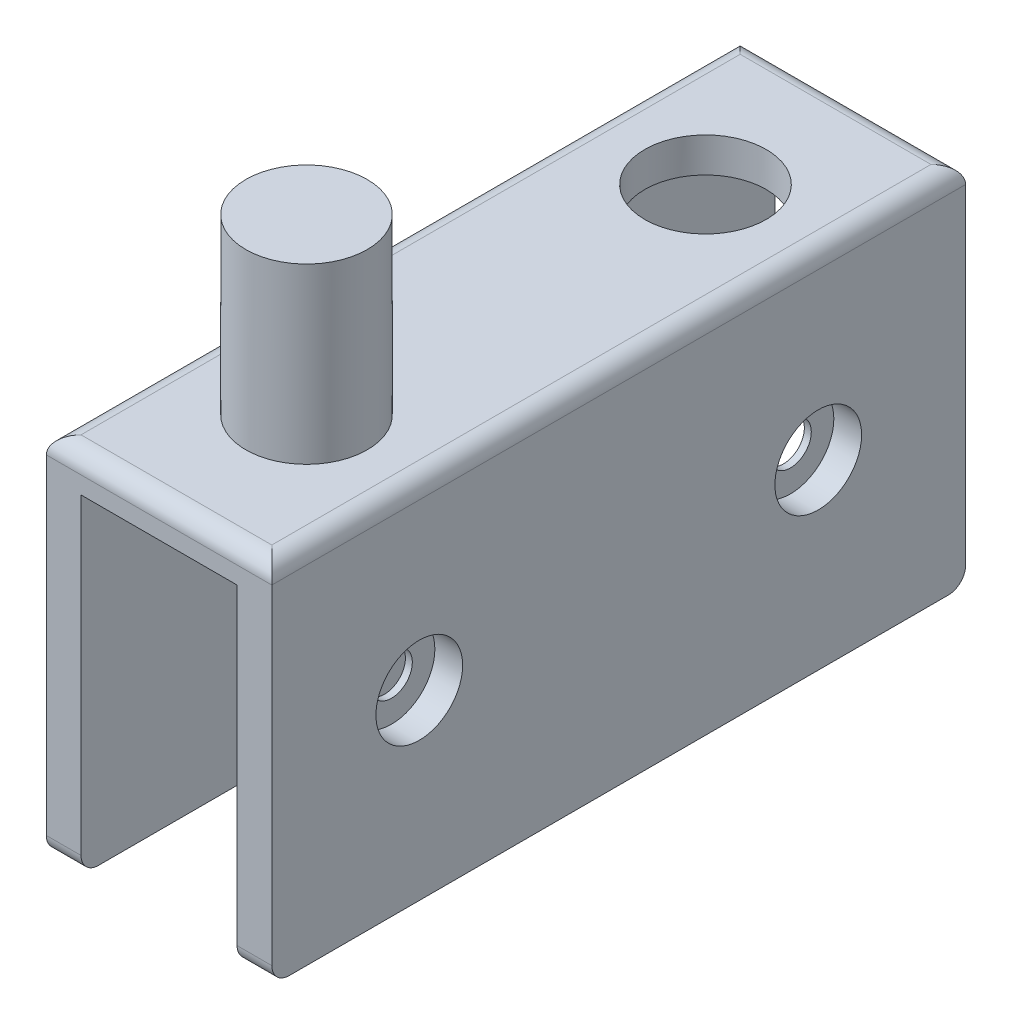
ISO-10303-21;
HEADER;
FILE_DESCRIPTION(('STEP AP214'),'2;1');
FILE_NAME('part.step','',(''),(''),'','','');
FILE_SCHEMA(('AUTOMOTIVE_DESIGN { 1 0 10303 214 1 1 1 1 }'));
ENDSEC;
DATA;
#1=APPLICATION_CONTEXT('core data for automotive mechanical design processes');
#2=APPLICATION_PROTOCOL_DEFINITION('international standard','automotive_design',2000,#1);
#3=PRODUCT_CONTEXT('',#1,'mechanical');
#4=PRODUCT('Part','Part','',(#3));
#5=PRODUCT_RELATED_PRODUCT_CATEGORY('part','',(#4));
#6=PRODUCT_DEFINITION_FORMATION('','',#4);
#7=PRODUCT_DEFINITION_CONTEXT('part definition',#1,'design');
#8=PRODUCT_DEFINITION('design','',#6,#7);
#9=PRODUCT_DEFINITION_SHAPE('','',#8);
#10=(LENGTH_UNIT() NAMED_UNIT(*) SI_UNIT(.MILLI.,.METRE.));
#11=(NAMED_UNIT(*) PLANE_ANGLE_UNIT() SI_UNIT($,.RADIAN.));
#12=(NAMED_UNIT(*) SI_UNIT($,.STERADIAN.) SOLID_ANGLE_UNIT());
#13=UNCERTAINTY_MEASURE_WITH_UNIT(LENGTH_MEASURE(1.E-05),#10,'distance_accuracy_value','');
#14=(GEOMETRIC_REPRESENTATION_CONTEXT(3) GLOBAL_UNCERTAINTY_ASSIGNED_CONTEXT((#13)) GLOBAL_UNIT_ASSIGNED_CONTEXT((#10,
#11,#12)) REPRESENTATION_CONTEXT('',''));
#15=CARTESIAN_POINT('',(0.,0.,0.));
#16=DIRECTION('',(0.,0.,1.));
#17=DIRECTION('',(1.,0.,0.));
#18=AXIS2_PLACEMENT_3D('',#15,#16,#17);
#19=CARTESIAN_POINT('',(-6.5,0.,20.));
#20=DIRECTION('',(1.,0.,0.));
#21=DIRECTION('',(0.,1.,0.));
#22=AXIS2_PLACEMENT_3D('',#19,#20,#21);
#23=PLANE('',#22);
#24=DIRECTION('',(0.,-1.,0.));
#25=VECTOR('',#24,1.);
#26=CARTESIAN_POINT('',(-6.5,0.,-20.));
#27=LINE('',#26,#25);
#28=CARTESIAN_POINT('',(-6.5,20.,-20.));
#29=VERTEX_POINT('',#28);
#30=CARTESIAN_POINT('',(-6.5,0.999999999999999,-20.));
#31=VERTEX_POINT('',#30);
#32=EDGE_CURVE('E174',#29,#31,#27,.T.);
#33=ORIENTED_EDGE('',*,*,#32,.T.);
#34=CARTESIAN_POINT('',(-6.5,0.999999999999999,-19.));
#35=DIRECTION('',(1.,0.,0.));
#36=DIRECTION('',(0.,1.,0.));
#37=AXIS2_PLACEMENT_3D('',#34,#35,#36);
#38=CIRCLE('',#37,1.);
#39=CARTESIAN_POINT('',(-6.5,0.,-19.));
#40=VERTEX_POINT('',#39);
#41=EDGE_CURVE('E217',#31,#40,#38,.F.);
#42=ORIENTED_EDGE('',*,*,#41,.T.);
#43=DIRECTION('',(0.,0.,-1.));
#44=VECTOR('',#43,1.);
#45=CARTESIAN_POINT('',(-6.5,0.,20.));
#46=LINE('',#45,#44);
#47=CARTESIAN_POINT('',(-6.5,0.,19.));
#48=VERTEX_POINT('',#47);
#49=EDGE_CURVE('E194',#48,#40,#46,.T.);
#50=ORIENTED_EDGE('',*,*,#49,.F.);
#51=CARTESIAN_POINT('',(-6.5,0.999999999999999,19.));
#52=DIRECTION('',(1.,0.,0.));
#53=DIRECTION('',(0.,1.,0.));
#54=AXIS2_PLACEMENT_3D('',#51,#52,#53);
#55=CIRCLE('',#54,1.);
#56=CARTESIAN_POINT('',(-6.5,0.999999999999999,20.));
#57=VERTEX_POINT('',#56);
#58=EDGE_CURVE('E215',#48,#57,#55,.F.);
#59=ORIENTED_EDGE('',*,*,#58,.T.);
#60=DIRECTION('',(0.,-1.,0.));
#61=VECTOR('',#60,1.);
#62=CARTESIAN_POINT('',(-6.5,0.,20.));
#63=LINE('',#62,#61);
#64=CARTESIAN_POINT('',(-6.5,20.,20.));
#65=VERTEX_POINT('',#64);
#66=EDGE_CURVE('E161',#65,#57,#63,.T.);
#67=ORIENTED_EDGE('',*,*,#66,.F.);
#68=DIRECTION('',(0.,0.,-1.));
#69=VECTOR('',#68,1.);
#70=CARTESIAN_POINT('',(-6.5,20.,20.));
#71=LINE('',#70,#69);
#72=EDGE_CURVE('E213',#65,#29,#71,.T.);
#73=ORIENTED_EDGE('',*,*,#72,.T.);
#74=EDGE_LOOP('',(#33,#42,#50,#59,#67,#73));
#75=FACE_BOUND('',#74,.T.);
#76=ADVANCED_FACE('F37',(#75),#23,.F.);
#77=CARTESIAN_POINT('',(0.,0.,20.));
#78=DIRECTION('',(0.,1.,0.));
#79=DIRECTION('',(-1.,0.,0.));
#80=AXIS2_PLACEMENT_3D('',#77,#78,#79);
#81=PLANE('',#80);
#82=ORIENTED_EDGE('',*,*,#49,.T.);
#83=DIRECTION('',(1.,0.,0.));
#84=VECTOR('',#83,1.);
#85=CARTESIAN_POINT('',(0.,0.,-19.));
#86=LINE('',#85,#84);
#87=CARTESIAN_POINT('',(-4.5,0.,-19.));
#88=VERTEX_POINT('',#87);
#89=EDGE_CURVE('E199',#40,#88,#86,.T.);
#90=ORIENTED_EDGE('',*,*,#89,.T.);
#91=DIRECTION('',(0.,0.,-1.));
#92=VECTOR('',#91,1.);
#93=CARTESIAN_POINT('',(-4.5,0.,20.));
#94=LINE('',#93,#92);
#95=CARTESIAN_POINT('',(-4.5,0.,19.));
#96=VERTEX_POINT('',#95);
#97=EDGE_CURVE('E149',#96,#88,#94,.T.);
#98=ORIENTED_EDGE('',*,*,#97,.F.);
#99=DIRECTION('',(1.,0.,0.));
#100=VECTOR('',#99,1.);
#101=CARTESIAN_POINT('',(-6.5,0.,19.));
#102=LINE('',#101,#100);
#103=EDGE_CURVE('E197',#96,#48,#102,.F.);
#104=ORIENTED_EDGE('',*,*,#103,.T.);
#105=EDGE_LOOP('',(#82,#90,#98,#104));
#106=FACE_BOUND('',#105,.T.);
#107=ADVANCED_FACE('F295',(#106),#81,.F.);
#108=CARTESIAN_POINT('',(-4.5,0.,20.));
#109=DIRECTION('',(1.,0.,0.));
#110=DIRECTION('',(0.,1.,0.));
#111=AXIS2_PLACEMENT_3D('',#108,#109,#110);
#112=PLANE('',#111);
#113=ORIENTED_EDGE('',*,*,#97,.T.);
#114=CARTESIAN_POINT('',(-4.5,0.999999999999999,-19.));
#115=DIRECTION('',(1.,0.,0.));
#116=DIRECTION('',(0.,1.,0.));
#117=AXIS2_PLACEMENT_3D('',#114,#115,#116);
#118=CIRCLE('',#117,1.);
#119=CARTESIAN_POINT('',(-4.5,0.999999999999999,-20.));
#120=VERTEX_POINT('',#119);
#121=EDGE_CURVE('E204',#88,#120,#118,.T.);
#122=ORIENTED_EDGE('',*,*,#121,.T.);
#123=DIRECTION('',(0.,-1.,0.));
#124=VECTOR('',#123,1.);
#125=CARTESIAN_POINT('',(-4.5,0.,-20.));
#126=LINE('',#125,#124);
#127=CARTESIAN_POINT('',(-4.5,19.,-20.));
#128=VERTEX_POINT('',#127);
#129=EDGE_CURVE('E144',#128,#120,#126,.T.);
#130=ORIENTED_EDGE('',*,*,#129,.F.);
#131=DIRECTION('',(0.,0.,-1.));
#132=VECTOR('',#131,1.);
#133=CARTESIAN_POINT('',(-4.5,19.,20.));
#134=LINE('',#133,#132);
#135=CARTESIAN_POINT('',(-4.5,19.,20.));
#136=VERTEX_POINT('',#135);
#137=EDGE_CURVE('E138',#136,#128,#134,.T.);
#138=ORIENTED_EDGE('',*,*,#137,.F.);
#139=DIRECTION('',(0.,-1.,0.));
#140=VECTOR('',#139,1.);
#141=CARTESIAN_POINT('',(-4.5,0.,20.));
#142=LINE('',#141,#140);
#143=CARTESIAN_POINT('',(-4.5,0.999999999999999,20.));
#144=VERTEX_POINT('',#143);
#145=EDGE_CURVE('E142',#136,#144,#142,.T.);
#146=ORIENTED_EDGE('',*,*,#145,.T.);
#147=CARTESIAN_POINT('',(-4.5,0.999999999999999,19.));
#148=DIRECTION('',(1.,0.,0.));
#149=DIRECTION('',(0.,1.,0.));
#150=AXIS2_PLACEMENT_3D('',#147,#148,#149);
#151=CIRCLE('',#150,1.);
#152=EDGE_CURVE('E202',#144,#96,#151,.T.);
#153=ORIENTED_EDGE('',*,*,#152,.T.);
#154=EDGE_LOOP('',(#113,#122,#130,#138,#146,#153));
#155=FACE_BOUND('',#154,.T.);
#156=ADVANCED_FACE('F141',(#155),#112,.T.);
#157=CARTESIAN_POINT('',(0.,19.,20.));
#158=DIRECTION('',(0.,-1.,0.));
#159=DIRECTION('',(0.,0.,-1.));
#160=AXIS2_PLACEMENT_3D('',#157,#158,#159);
#161=PLANE('',#160);
#162=CARTESIAN_POINT('',(0.,19.,-11.5));
#163=DIRECTION('',(0.,-1.,0.));
#164=DIRECTION('',(0.,0.,-1.));
#165=AXIS2_PLACEMENT_3D('',#162,#163,#164);
#166=CIRCLE('',#165,3.5);
#167=CARTESIAN_POINT('',(0.,19.,-15.));
#168=VERTEX_POINT('',#167);
#169=EDGE_CURVE('E533',#168,#168,#166,.T.);
#170=ORIENTED_EDGE('',*,*,#169,.F.);
#171=EDGE_LOOP('',(#170));
#172=FACE_BOUND('',#171,.T.);
#173=DIRECTION('',(-1.,0.,0.));
#174=VECTOR('',#173,1.);
#175=CARTESIAN_POINT('',(0.,19.,-20.));
#176=LINE('',#175,#174);
#177=CARTESIAN_POINT('',(4.5,19.,-20.));
#178=VERTEX_POINT('',#177);
#179=EDGE_CURVE('E179',#178,#128,#176,.T.);
#180=ORIENTED_EDGE('',*,*,#179,.F.);
#181=DIRECTION('',(0.,0.,-1.));
#182=VECTOR('',#181,1.);
#183=CARTESIAN_POINT('',(4.5,19.,20.));
#184=LINE('',#183,#182);
#185=CARTESIAN_POINT('',(4.5,19.,20.));
#186=VERTEX_POINT('',#185);
#187=EDGE_CURVE('E150',#186,#178,#184,.T.);
#188=ORIENTED_EDGE('',*,*,#187,.F.);
#189=DIRECTION('',(-1.,0.,0.));
#190=VECTOR('',#189,1.);
#191=CARTESIAN_POINT('',(0.,19.,20.));
#192=LINE('',#191,#190);
#193=EDGE_CURVE('E158',#186,#136,#192,.T.);
#194=ORIENTED_EDGE('',*,*,#193,.T.);
#195=ORIENTED_EDGE('',*,*,#137,.T.);
#196=EDGE_LOOP('',(#180,#188,#194,#195));
#197=FACE_BOUND('',#196,.T.);
#198=ADVANCED_FACE('F163',(#172,#197),#161,.T.);
#199=CARTESIAN_POINT('',(4.5,0.,20.));
#200=DIRECTION('',(1.,0.,0.));
#201=DIRECTION('',(0.,1.,0.));
#202=AXIS2_PLACEMENT_3D('',#199,#200,#201);
#203=PLANE('',#202);
#204=CARTESIAN_POINT('',(4.5,10.5,11.5));
#205=DIRECTION('',(1.,0.,0.));
#206=DIRECTION('',(0.,1.,0.));
#207=AXIS2_PLACEMENT_3D('',#204,#205,#206);
#208=CIRCLE('',#207,1.2);
#209=CARTESIAN_POINT('',(4.5,11.7,11.5));
#210=VERTEX_POINT('',#209);
#211=EDGE_CURVE('E272',#210,#210,#208,.T.);
#212=ORIENTED_EDGE('',*,*,#211,.T.);
#213=EDGE_LOOP('',(#212));
#214=FACE_BOUND('',#213,.T.);
#215=CARTESIAN_POINT('',(4.5,10.5,-11.5));
#216=DIRECTION('',(1.,0.,0.));
#217=DIRECTION('',(0.,1.,0.));
#218=AXIS2_PLACEMENT_3D('',#215,#216,#217);
#219=CIRCLE('',#218,1.2);
#220=CARTESIAN_POINT('',(4.5,11.7,-11.5));
#221=VERTEX_POINT('',#220);
#222=EDGE_CURVE('E177',#221,#221,#219,.T.);
#223=ORIENTED_EDGE('',*,*,#222,.T.);
#224=EDGE_LOOP('',(#223));
#225=FACE_BOUND('',#224,.T.);
#226=DIRECTION('',(0.,-1.,0.));
#227=VECTOR('',#226,1.);
#228=CARTESIAN_POINT('',(4.5,0.,-20.));
#229=LINE('',#228,#227);
#230=CARTESIAN_POINT('',(4.5,0.999999999999999,-20.));
#231=VERTEX_POINT('',#230);
#232=EDGE_CURVE('E181',#178,#231,#229,.T.);
#233=ORIENTED_EDGE('',*,*,#232,.T.);
#234=CARTESIAN_POINT('',(4.5,0.999999999999999,-19.));
#235=DIRECTION('',(1.,0.,0.));
#236=DIRECTION('',(0.,1.,0.));
#237=AXIS2_PLACEMENT_3D('',#234,#235,#236);
#238=CIRCLE('',#237,1.);
#239=CARTESIAN_POINT('',(4.5,0.,-19.));
#240=VERTEX_POINT('',#239);
#241=EDGE_CURVE('E227',#231,#240,#238,.F.);
#242=ORIENTED_EDGE('',*,*,#241,.T.);
#243=DIRECTION('',(0.,0.,-1.));
#244=VECTOR('',#243,1.);
#245=CARTESIAN_POINT('',(4.5,0.,20.));
#246=LINE('',#245,#244);
#247=CARTESIAN_POINT('',(4.5,0.,19.));
#248=VERTEX_POINT('',#247);
#249=EDGE_CURVE('E189',#248,#240,#246,.T.);
#250=ORIENTED_EDGE('',*,*,#249,.F.);
#251=CARTESIAN_POINT('',(4.5,0.999999999999999,19.));
#252=DIRECTION('',(1.,0.,0.));
#253=DIRECTION('',(0.,1.,0.));
#254=AXIS2_PLACEMENT_3D('',#251,#252,#253);
#255=CIRCLE('',#254,1.);
#256=CARTESIAN_POINT('',(4.5,0.999999999999999,20.));
#257=VERTEX_POINT('',#256);
#258=EDGE_CURVE('E225',#248,#257,#255,.F.);
#259=ORIENTED_EDGE('',*,*,#258,.T.);
#260=DIRECTION('',(0.,-1.,0.));
#261=VECTOR('',#260,1.);
#262=CARTESIAN_POINT('',(4.5,0.,20.));
#263=LINE('',#262,#261);
#264=EDGE_CURVE('E165',#186,#257,#263,.T.);
#265=ORIENTED_EDGE('',*,*,#264,.F.);
#266=ORIENTED_EDGE('',*,*,#187,.T.);
#267=EDGE_LOOP('',(#233,#242,#250,#259,#265,#266));
#268=FACE_BOUND('',#267,.T.);
#269=ADVANCED_FACE('F308',(#214,#225,#268),#203,.F.);
#270=CARTESIAN_POINT('',(0.,0.,20.));
#271=DIRECTION('',(0.,-1.,0.));
#272=DIRECTION('',(1.,0.,0.));
#273=AXIS2_PLACEMENT_3D('',#270,#271,#272);
#274=PLANE('',#273);
#275=ORIENTED_EDGE('',*,*,#249,.T.);
#276=DIRECTION('',(-1.,0.,0.));
#277=VECTOR('',#276,1.);
#278=CARTESIAN_POINT('',(6.5,0.,-19.));
#279=LINE('',#278,#277);
#280=CARTESIAN_POINT('',(6.5,0.,-19.));
#281=VERTEX_POINT('',#280);
#282=EDGE_CURVE('E232',#240,#281,#279,.F.);
#283=ORIENTED_EDGE('',*,*,#282,.T.);
#284=DIRECTION('',(0.,0.,-1.));
#285=VECTOR('',#284,1.);
#286=CARTESIAN_POINT('',(6.5,0.,20.));
#287=LINE('',#286,#285);
#288=CARTESIAN_POINT('',(6.5,0.,19.));
#289=VERTEX_POINT('',#288);
#290=EDGE_CURVE('E173',#289,#281,#287,.T.);
#291=ORIENTED_EDGE('',*,*,#290,.F.);
#292=DIRECTION('',(-1.,0.,0.));
#293=VECTOR('',#292,1.);
#294=CARTESIAN_POINT('',(0.,0.,19.));
#295=LINE('',#294,#293);
#296=EDGE_CURVE('E229',#289,#248,#295,.T.);
#297=ORIENTED_EDGE('',*,*,#296,.T.);
#298=EDGE_LOOP('',(#275,#283,#291,#297));
#299=FACE_BOUND('',#298,.T.);
#300=ADVANCED_FACE('F320',(#299),#274,.T.);
#301=CARTESIAN_POINT('',(6.5,0.,20.));
#302=DIRECTION('',(1.,0.,0.));
#303=DIRECTION('',(0.,1.,0.));
#304=AXIS2_PLACEMENT_3D('',#301,#302,#303);
#305=PLANE('',#304);
#306=CARTESIAN_POINT('',(6.5,10.5,11.5));
#307=DIRECTION('',(1.,0.,0.));
#308=DIRECTION('',(0.,0.,-1.));
#309=AXIS2_PLACEMENT_3D('',#306,#307,#308);
#310=CIRCLE('',#309,2.5);
#311=CARTESIAN_POINT('',(6.5,10.5,9.));
#312=VERTEX_POINT('',#311);
#313=EDGE_CURVE('E254',#312,#312,#310,.T.);
#314=ORIENTED_EDGE('',*,*,#313,.F.);
#315=EDGE_LOOP('',(#314));
#316=FACE_BOUND('',#315,.T.);
#317=CARTESIAN_POINT('',(6.5,10.5,-11.5));
#318=DIRECTION('',(1.,0.,0.));
#319=DIRECTION('',(0.,0.,-1.));
#320=AXIS2_PLACEMENT_3D('',#317,#318,#319);
#321=CIRCLE('',#320,2.5);
#322=CARTESIAN_POINT('',(6.5,10.5,-14.));
#323=VERTEX_POINT('',#322);
#324=EDGE_CURVE('E275',#323,#323,#321,.T.);
#325=ORIENTED_EDGE('',*,*,#324,.F.);
#326=EDGE_LOOP('',(#325));
#327=FACE_BOUND('',#326,.T.);
#328=ORIENTED_EDGE('',*,*,#290,.T.);
#329=CARTESIAN_POINT('',(6.5,0.999999999999999,-19.));
#330=DIRECTION('',(1.,0.,0.));
#331=DIRECTION('',(0.,1.,0.));
#332=AXIS2_PLACEMENT_3D('',#329,#330,#331);
#333=CIRCLE('',#332,1.);
#334=CARTESIAN_POINT('',(6.5,0.999999999999999,-20.));
#335=VERTEX_POINT('',#334);
#336=EDGE_CURVE('E238',#281,#335,#333,.T.);
#337=ORIENTED_EDGE('',*,*,#336,.T.);
#338=DIRECTION('',(0.,-1.,0.));
#339=VECTOR('',#338,1.);
#340=CARTESIAN_POINT('',(6.5,0.,-20.));
#341=LINE('',#340,#339);
#342=CARTESIAN_POINT('',(6.5,20.,-20.));
#343=VERTEX_POINT('',#342);
#344=EDGE_CURVE('E184',#343,#335,#341,.T.);
#345=ORIENTED_EDGE('',*,*,#344,.F.);
#346=DIRECTION('',(0.,0.,-1.));
#347=VECTOR('',#346,1.);
#348=CARTESIAN_POINT('',(6.5,20.,20.));
#349=LINE('',#348,#347);
#350=CARTESIAN_POINT('',(6.5,20.,20.));
#351=VERTEX_POINT('',#350);
#352=EDGE_CURVE('E234',#343,#351,#349,.F.);
#353=ORIENTED_EDGE('',*,*,#352,.T.);
#354=DIRECTION('',(0.,-1.,0.));
#355=VECTOR('',#354,1.);
#356=CARTESIAN_POINT('',(6.5,0.,20.));
#357=LINE('',#356,#355);
#358=CARTESIAN_POINT('',(6.5,0.999999999999999,20.));
#359=VERTEX_POINT('',#358);
#360=EDGE_CURVE('E167',#351,#359,#357,.T.);
#361=ORIENTED_EDGE('',*,*,#360,.T.);
#362=CARTESIAN_POINT('',(6.5,0.999999999999999,19.));
#363=DIRECTION('',(1.,0.,0.));
#364=DIRECTION('',(0.,1.,0.));
#365=AXIS2_PLACEMENT_3D('',#362,#363,#364);
#366=CIRCLE('',#365,1.);
#367=EDGE_CURVE('E236',#359,#289,#366,.T.);
#368=ORIENTED_EDGE('',*,*,#367,.T.);
#369=EDGE_LOOP('',(#328,#337,#345,#353,#361,#368));
#370=FACE_BOUND('',#369,.T.);
#371=ADVANCED_FACE('F317',(#316,#327,#370),#305,.T.);
#372=CARTESIAN_POINT('',(0.,21.,20.));
#373=DIRECTION('',(0.,-1.,0.));
#374=DIRECTION('',(0.,0.,-1.));
#375=AXIS2_PLACEMENT_3D('',#372,#373,#374);
#376=PLANE('',#375);
#377=CARTESIAN_POINT('',(0.,21.,-11.5));
#378=DIRECTION('',(0.,1.,0.));
#379=DIRECTION('',(0.,0.,1.));
#380=AXIS2_PLACEMENT_3D('',#377,#378,#379);
#381=CIRCLE('',#380,3.5);
#382=CARTESIAN_POINT('',(0.,21.,-8.));
#383=VERTEX_POINT('',#382);
#384=EDGE_CURVE('E536',#383,#383,#381,.T.);
#385=ORIENTED_EDGE('',*,*,#384,.F.);
#386=EDGE_LOOP('',(#385));
#387=FACE_BOUND('',#386,.T.);
#388=CARTESIAN_POINT('',(0.,21.,11.5));
#389=DIRECTION('',(0.,-1.,0.));
#390=DIRECTION('',(0.,0.,-1.));
#391=AXIS2_PLACEMENT_3D('',#388,#389,#390);
#392=CIRCLE('',#391,3.5);
#393=CARTESIAN_POINT('',(0.,21.,8.));
#394=VERTEX_POINT('',#393);
#395=EDGE_CURVE('E11',#394,#394,#392,.F.);
#396=ORIENTED_EDGE('',*,*,#395,.F.);
#397=EDGE_LOOP('',(#396));
#398=FACE_BOUND('',#397,.T.);
#399=DIRECTION('',(0.,0.,-1.));
#400=VECTOR('',#399,1.);
#401=CARTESIAN_POINT('',(-5.5,21.,20.));
#402=LINE('',#401,#400);
#403=CARTESIAN_POINT('',(-5.5,21.,-19.));
#404=VERTEX_POINT('',#403);
#405=CARTESIAN_POINT('',(-5.5,21.,19.));
#406=VERTEX_POINT('',#405);
#407=EDGE_CURVE('E52',#404,#406,#402,.F.);
#408=ORIENTED_EDGE('',*,*,#407,.T.);
#409=DIRECTION('',(-1.,0.,0.));
#410=VECTOR('',#409,1.);
#411=CARTESIAN_POINT('',(6.5,21.,19.));
#412=LINE('',#411,#410);
#413=CARTESIAN_POINT('',(5.5,21.,19.));
#414=VERTEX_POINT('',#413);
#415=EDGE_CURVE('E45',#406,#414,#412,.F.);
#416=ORIENTED_EDGE('',*,*,#415,.T.);
#417=DIRECTION('',(0.,0.,-1.));
#418=VECTOR('',#417,1.);
#419=CARTESIAN_POINT('',(5.5,21.,-20.));
#420=LINE('',#419,#418);
#421=CARTESIAN_POINT('',(5.5,21.,-19.));
#422=VERTEX_POINT('',#421);
#423=EDGE_CURVE('E240',#414,#422,#420,.T.);
#424=ORIENTED_EDGE('',*,*,#423,.T.);
#425=DIRECTION('',(-1.,0.,0.));
#426=VECTOR('',#425,1.);
#427=CARTESIAN_POINT('',(0.,21.,-19.));
#428=LINE('',#427,#426);
#429=EDGE_CURVE('E57',#422,#404,#428,.T.);
#430=ORIENTED_EDGE('',*,*,#429,.T.);
#431=EDGE_LOOP('',(#408,#416,#424,#430));
#432=FACE_BOUND('',#431,.T.);
#433=ADVANCED_FACE('F334',(#387,#398,#432),#376,.F.);
#434=CARTESIAN_POINT('',(0.,0.,20.));
#435=DIRECTION('',(0.,0.,1.));
#436=DIRECTION('',(1.,0.,0.));
#437=AXIS2_PLACEMENT_3D('',#434,#435,#436);
#438=PLANE('',#437);
#439=ORIENTED_EDGE('',*,*,#66,.T.);
#440=DIRECTION('',(1.,0.,0.));
#441=VECTOR('',#440,1.);
#442=CARTESIAN_POINT('',(-4.5,0.999999999999999,20.));
#443=LINE('',#442,#441);
#444=EDGE_CURVE('E160',#57,#144,#443,.T.);
#445=ORIENTED_EDGE('',*,*,#444,.T.);
#446=ORIENTED_EDGE('',*,*,#145,.F.);
#447=ORIENTED_EDGE('',*,*,#193,.F.);
#448=ORIENTED_EDGE('',*,*,#264,.T.);
#449=DIRECTION('',(-1.,0.,0.));
#450=VECTOR('',#449,1.);
#451=CARTESIAN_POINT('',(0.,1.,20.));
#452=LINE('',#451,#450);
#453=EDGE_CURVE('E222',#257,#359,#452,.F.);
#454=ORIENTED_EDGE('',*,*,#453,.T.);
#455=ORIENTED_EDGE('',*,*,#360,.F.);
#456=DIRECTION('',(-1.,0.,0.));
#457=VECTOR('',#456,1.);
#458=CARTESIAN_POINT('',(-6.5,20.,20.));
#459=LINE('',#458,#457);
#460=EDGE_CURVE('E219',#351,#65,#459,.T.);
#461=ORIENTED_EDGE('',*,*,#460,.T.);
#462=EDGE_LOOP('',(#439,#445,#446,#447,#448,#454,#455,#461));
#463=FACE_BOUND('',#462,.T.);
#464=ADVANCED_FACE('F156',(#463),#438,.T.);
#465=CARTESIAN_POINT('',(0.,0.,-20.));
#466=DIRECTION('',(0.,0.,1.));
#467=DIRECTION('',(1.,0.,0.));
#468=AXIS2_PLACEMENT_3D('',#465,#466,#467);
#469=PLANE('',#468);
#470=ORIENTED_EDGE('',*,*,#129,.T.);
#471=DIRECTION('',(1.,0.,0.));
#472=VECTOR('',#471,1.);
#473=CARTESIAN_POINT('',(0.,1.,-20.));
#474=LINE('',#473,#472);
#475=EDGE_CURVE('E211',#120,#31,#474,.F.);
#476=ORIENTED_EDGE('',*,*,#475,.T.);
#477=ORIENTED_EDGE('',*,*,#32,.F.);
#478=DIRECTION('',(-1.,0.,0.));
#479=VECTOR('',#478,1.);
#480=CARTESIAN_POINT('',(0.,20.,-20.));
#481=LINE('',#480,#479);
#482=EDGE_CURVE('E206',#29,#343,#481,.F.);
#483=ORIENTED_EDGE('',*,*,#482,.T.);
#484=ORIENTED_EDGE('',*,*,#344,.T.);
#485=DIRECTION('',(-1.,0.,0.));
#486=VECTOR('',#485,1.);
#487=CARTESIAN_POINT('',(4.5,0.999999999999999,-20.));
#488=LINE('',#487,#486);
#489=EDGE_CURVE('E208',#335,#231,#488,.T.);
#490=ORIENTED_EDGE('',*,*,#489,.T.);
#491=ORIENTED_EDGE('',*,*,#232,.F.);
#492=ORIENTED_EDGE('',*,*,#179,.T.);
#493=EDGE_LOOP('',(#470,#476,#477,#483,#484,#490,#491,#492));
#494=FACE_BOUND('',#493,.T.);
#495=ADVANCED_FACE('F303',(#494),#469,.F.);
#496=CARTESIAN_POINT('',(6.5,10.5,-11.5));
#497=DIRECTION('',(1.,0.,0.));
#498=DIRECTION('',(0.,0.,-1.));
#499=AXIS2_PLACEMENT_3D('',#496,#497,#498);
#500=CYLINDRICAL_SURFACE('',#499,1.2);
#501=ORIENTED_EDGE('',*,*,#222,.F.);
#502=EDGE_LOOP('',(#501));
#503=FACE_BOUND('',#502,.T.);
#504=CARTESIAN_POINT('',(4.9,10.5,-11.5));
#505=DIRECTION('',(1.,0.,0.));
#506=DIRECTION('',(0.,0.,-1.));
#507=AXIS2_PLACEMENT_3D('',#504,#505,#506);
#508=CIRCLE('',#507,1.2);
#509=CARTESIAN_POINT('',(4.9,10.5,-12.7));
#510=VERTEX_POINT('',#509);
#511=EDGE_CURVE('E281',#510,#510,#508,.T.);
#512=ORIENTED_EDGE('',*,*,#511,.T.);
#513=EDGE_LOOP('',(#512));
#514=FACE_BOUND('',#513,.T.);
#515=ADVANCED_FACE('F395',(#503,#514),#500,.F.);
#516=CARTESIAN_POINT('',(4.9,11.7,-11.5));
#517=DIRECTION('',(-1.,0.,0.));
#518=DIRECTION('',(0.,0.,1.));
#519=AXIS2_PLACEMENT_3D('',#516,#517,#518);
#520=PLANE('',#519);
#521=ORIENTED_EDGE('',*,*,#511,.F.);
#522=EDGE_LOOP('',(#521));
#523=FACE_BOUND('',#522,.T.);
#524=CARTESIAN_POINT('',(4.9,10.5,-11.5));
#525=DIRECTION('',(1.,0.,0.));
#526=DIRECTION('',(0.,0.,-1.));
#527=AXIS2_PLACEMENT_3D('',#524,#525,#526);
#528=CIRCLE('',#527,2.5);
#529=CARTESIAN_POINT('',(4.9,10.5,-14.));
#530=VERTEX_POINT('',#529);
#531=EDGE_CURVE('E278',#530,#530,#528,.T.);
#532=ORIENTED_EDGE('',*,*,#531,.T.);
#533=EDGE_LOOP('',(#532));
#534=FACE_BOUND('',#533,.T.);
#535=ADVANCED_FACE('F391',(#523,#534),#520,.F.);
#536=CARTESIAN_POINT('',(6.5,10.5,-11.5));
#537=DIRECTION('',(1.,0.,0.));
#538=DIRECTION('',(0.,0.,-1.));
#539=AXIS2_PLACEMENT_3D('',#536,#537,#538);
#540=CYLINDRICAL_SURFACE('',#539,2.5);
#541=ORIENTED_EDGE('',*,*,#531,.F.);
#542=EDGE_LOOP('',(#541));
#543=FACE_BOUND('',#542,.T.);
#544=ORIENTED_EDGE('',*,*,#324,.T.);
#545=EDGE_LOOP('',(#544));
#546=FACE_BOUND('',#545,.T.);
#547=ADVANCED_FACE('F387',(#543,#546),#540,.F.);
#548=CARTESIAN_POINT('',(6.5,10.5,11.5));
#549=DIRECTION('',(1.,0.,0.));
#550=DIRECTION('',(0.,0.,-1.));
#551=AXIS2_PLACEMENT_3D('',#548,#549,#550);
#552=CYLINDRICAL_SURFACE('',#551,1.2);
#553=ORIENTED_EDGE('',*,*,#211,.F.);
#554=EDGE_LOOP('',(#553));
#555=FACE_BOUND('',#554,.T.);
#556=CARTESIAN_POINT('',(4.9,10.5,11.5));
#557=DIRECTION('',(1.,0.,0.));
#558=DIRECTION('',(0.,0.,-1.));
#559=AXIS2_PLACEMENT_3D('',#556,#557,#558);
#560=CIRCLE('',#559,1.2);
#561=CARTESIAN_POINT('',(4.9,10.5,10.3));
#562=VERTEX_POINT('',#561);
#563=EDGE_CURVE('E265',#562,#562,#560,.T.);
#564=ORIENTED_EDGE('',*,*,#563,.T.);
#565=EDGE_LOOP('',(#564));
#566=FACE_BOUND('',#565,.T.);
#567=ADVANCED_FACE('F383',(#555,#566),#552,.F.);
#568=CARTESIAN_POINT('',(4.9,11.7,11.5));
#569=DIRECTION('',(-1.,0.,0.));
#570=DIRECTION('',(0.,0.,1.));
#571=AXIS2_PLACEMENT_3D('',#568,#569,#570);
#572=PLANE('',#571);
#573=ORIENTED_EDGE('',*,*,#563,.F.);
#574=EDGE_LOOP('',(#573));
#575=FACE_BOUND('',#574,.T.);
#576=CARTESIAN_POINT('',(4.9,10.5,11.5));
#577=DIRECTION('',(1.,0.,0.));
#578=DIRECTION('',(0.,0.,-1.));
#579=AXIS2_PLACEMENT_3D('',#576,#577,#578);
#580=CIRCLE('',#579,2.5);
#581=CARTESIAN_POINT('',(4.9,10.5,9.));
#582=VERTEX_POINT('',#581);
#583=EDGE_CURVE('E260',#582,#582,#580,.T.);
#584=ORIENTED_EDGE('',*,*,#583,.T.);
#585=EDGE_LOOP('',(#584));
#586=FACE_BOUND('',#585,.T.);
#587=ADVANCED_FACE('F379',(#575,#586),#572,.F.);
#588=CARTESIAN_POINT('',(6.5,10.5,11.5));
#589=DIRECTION('',(1.,0.,0.));
#590=DIRECTION('',(0.,0.,-1.));
#591=AXIS2_PLACEMENT_3D('',#588,#589,#590);
#592=CYLINDRICAL_SURFACE('',#591,2.5);
#593=ORIENTED_EDGE('',*,*,#583,.F.);
#594=EDGE_LOOP('',(#593));
#595=FACE_BOUND('',#594,.T.);
#596=ORIENTED_EDGE('',*,*,#313,.T.);
#597=EDGE_LOOP('',(#596));
#598=FACE_BOUND('',#597,.T.);
#599=ADVANCED_FACE('F352',(#595,#598),#592,.F.);
#600=CARTESIAN_POINT('',(0.,1.,-19.));
#601=DIRECTION('',(1.,0.,0.));
#602=DIRECTION('',(0.,1.,0.));
#603=AXIS2_PLACEMENT_3D('',#600,#601,#602);
#604=CYLINDRICAL_SURFACE('',#603,1.);
#605=ORIENTED_EDGE('',*,*,#41,.F.);
#606=ORIENTED_EDGE('',*,*,#475,.F.);
#607=ORIENTED_EDGE('',*,*,#121,.F.);
#608=ORIENTED_EDGE('',*,*,#89,.F.);
#609=EDGE_LOOP('',(#605,#606,#607,#608));
#610=FACE_BOUND('',#609,.T.);
#611=ADVANCED_FACE('F300',(#610),#604,.T.);
#612=CARTESIAN_POINT('',(0.,1.,19.));
#613=DIRECTION('',(-1.,0.,0.));
#614=DIRECTION('',(0.,-1.,0.));
#615=AXIS2_PLACEMENT_3D('',#612,#613,#614);
#616=CYLINDRICAL_SURFACE('',#615,1.);
#617=ORIENTED_EDGE('',*,*,#58,.F.);
#618=ORIENTED_EDGE('',*,*,#103,.F.);
#619=ORIENTED_EDGE('',*,*,#152,.F.);
#620=ORIENTED_EDGE('',*,*,#444,.F.);
#621=EDGE_LOOP('',(#617,#618,#619,#620));
#622=FACE_BOUND('',#621,.T.);
#623=ADVANCED_FACE('F291',(#622),#616,.T.);
#624=CARTESIAN_POINT('',(0.,1.,-19.));
#625=DIRECTION('',(1.,0.,0.));
#626=DIRECTION('',(0.,1.,0.));
#627=AXIS2_PLACEMENT_3D('',#624,#625,#626);
#628=CYLINDRICAL_SURFACE('',#627,1.);
#629=ORIENTED_EDGE('',*,*,#336,.F.);
#630=ORIENTED_EDGE('',*,*,#282,.F.);
#631=ORIENTED_EDGE('',*,*,#241,.F.);
#632=ORIENTED_EDGE('',*,*,#489,.F.);
#633=EDGE_LOOP('',(#629,#630,#631,#632));
#634=FACE_BOUND('',#633,.T.);
#635=ADVANCED_FACE('F323',(#634),#628,.T.);
#636=CARTESIAN_POINT('',(0.,1.,19.));
#637=DIRECTION('',(-1.,0.,0.));
#638=DIRECTION('',(0.,-1.,0.));
#639=AXIS2_PLACEMENT_3D('',#636,#637,#638);
#640=CYLINDRICAL_SURFACE('',#639,1.);
#641=ORIENTED_EDGE('',*,*,#367,.F.);
#642=ORIENTED_EDGE('',*,*,#453,.F.);
#643=ORIENTED_EDGE('',*,*,#258,.F.);
#644=ORIENTED_EDGE('',*,*,#296,.F.);
#645=EDGE_LOOP('',(#641,#642,#643,#644));
#646=FACE_BOUND('',#645,.T.);
#647=ADVANCED_FACE('F313',(#646),#640,.T.);
#648=CARTESIAN_POINT('',(0.,20.,-19.));
#649=DIRECTION('',(-1.,0.,0.));
#650=DIRECTION('',(0.,0.,1.));
#651=AXIS2_PLACEMENT_3D('',#648,#649,#650);
#652=CYLINDRICAL_SURFACE('',#651,1.);
#653=CARTESIAN_POINT('',(-5.5,20.,-19.));
#654=DIRECTION('',(-0.707106781186547,0.,0.707106781186547));
#655=DIRECTION('',(-0.707106781186547,0.,-0.707106781186547));
#656=AXIS2_PLACEMENT_3D('',#653,#654,#655);
#657=ELLIPSE('',#656,1.41421356237309,1.);
#658=EDGE_CURVE('E250',#404,#29,#657,.T.);
#659=ORIENTED_EDGE('',*,*,#658,.F.);
#660=ORIENTED_EDGE('',*,*,#429,.F.);
#661=CARTESIAN_POINT('',(5.5,20.,-19.));
#662=DIRECTION('',(0.707106781186547,0.,0.707106781186547));
#663=DIRECTION('',(-0.707106781186547,0.,0.707106781186547));
#664=AXIS2_PLACEMENT_3D('',#661,#662,#663);
#665=ELLIPSE('',#664,1.41421356237309,1.);
#666=EDGE_CURVE('E252',#343,#422,#665,.T.);
#667=ORIENTED_EDGE('',*,*,#666,.F.);
#668=ORIENTED_EDGE('',*,*,#482,.F.);
#669=EDGE_LOOP('',(#659,#660,#667,#668));
#670=FACE_BOUND('',#669,.T.);
#671=ADVANCED_FACE('F39',(#670),#652,.T.);
#672=CARTESIAN_POINT('',(5.5,20.,20.));
#673=DIRECTION('',(0.,0.,1.));
#674=DIRECTION('',(1.,0.,0.));
#675=AXIS2_PLACEMENT_3D('',#672,#673,#674);
#676=CYLINDRICAL_SURFACE('',#675,1.);
#677=ORIENTED_EDGE('',*,*,#666,.T.);
#678=ORIENTED_EDGE('',*,*,#423,.F.);
#679=CARTESIAN_POINT('',(5.5,20.,19.));
#680=DIRECTION('',(-0.707106781186547,0.,0.707106781186547));
#681=DIRECTION('',(0.707106781186547,0.,0.707106781186547));
#682=AXIS2_PLACEMENT_3D('',#679,#680,#681);
#683=ELLIPSE('',#682,1.41421356237309,1.);
#684=EDGE_CURVE('E247',#351,#414,#683,.T.);
#685=ORIENTED_EDGE('',*,*,#684,.F.);
#686=ORIENTED_EDGE('',*,*,#352,.F.);
#687=EDGE_LOOP('',(#677,#678,#685,#686));
#688=FACE_BOUND('',#687,.T.);
#689=ADVANCED_FACE('F335',(#688),#676,.T.);
#690=CARTESIAN_POINT('',(-5.5,20.,20.));
#691=DIRECTION('',(0.,0.,-1.));
#692=DIRECTION('',(-1.,0.,0.));
#693=AXIS2_PLACEMENT_3D('',#690,#691,#692);
#694=CYLINDRICAL_SURFACE('',#693,1.);
#695=ORIENTED_EDGE('',*,*,#658,.T.);
#696=ORIENTED_EDGE('',*,*,#72,.F.);
#697=CARTESIAN_POINT('',(-5.5,20.,19.));
#698=DIRECTION('',(-0.707106781186547,0.,-0.707106781186547));
#699=DIRECTION('',(0.707106781186547,0.,-0.707106781186547));
#700=AXIS2_PLACEMENT_3D('',#697,#698,#699);
#701=ELLIPSE('',#700,1.41421356237309,1.);
#702=EDGE_CURVE('E245',#406,#65,#701,.F.);
#703=ORIENTED_EDGE('',*,*,#702,.F.);
#704=ORIENTED_EDGE('',*,*,#407,.F.);
#705=EDGE_LOOP('',(#695,#696,#703,#704));
#706=FACE_BOUND('',#705,.T.);
#707=ADVANCED_FACE('F329',(#706),#694,.T.);
#708=CARTESIAN_POINT('',(0.,20.,19.));
#709=DIRECTION('',(1.,0.,0.));
#710=DIRECTION('',(0.,0.,-1.));
#711=AXIS2_PLACEMENT_3D('',#708,#709,#710);
#712=CYLINDRICAL_SURFACE('',#711,1.);
#713=ORIENTED_EDGE('',*,*,#684,.T.);
#714=ORIENTED_EDGE('',*,*,#415,.F.);
#715=ORIENTED_EDGE('',*,*,#702,.T.);
#716=ORIENTED_EDGE('',*,*,#460,.F.);
#717=EDGE_LOOP('',(#713,#714,#715,#716));
#718=FACE_BOUND('',#717,.T.);
#719=ADVANCED_FACE('F332',(#718),#712,.T.);
#720=CARTESIAN_POINT('',(0.,31.,11.5));
#721=DIRECTION('',(0.,-1.,0.));
#722=DIRECTION('',(0.,0.,-1.));
#723=AXIS2_PLACEMENT_3D('',#720,#721,#722);
#724=CYLINDRICAL_SURFACE('',#723,3.5);
#725=CARTESIAN_POINT('',(0.,31.,11.5));
#726=DIRECTION('',(0.,1.,0.));
#727=DIRECTION('',(0.,0.,1.));
#728=AXIS2_PLACEMENT_3D('',#725,#726,#727);
#729=CIRCLE('',#728,3.5);
#730=CARTESIAN_POINT('',(0.,31.,15.));
#731=VERTEX_POINT('',#730);
#732=EDGE_CURVE('E248',#731,#731,#729,.T.);
#733=ORIENTED_EDGE('',*,*,#732,.F.);
#734=EDGE_LOOP('',(#733));
#735=FACE_BOUND('',#734,.T.);
#736=ORIENTED_EDGE('',*,*,#395,.T.);
#737=EDGE_LOOP('',(#736));
#738=FACE_BOUND('',#737,.T.);
#739=ADVANCED_FACE('F360',(#735,#738),#724,.T.);
#740=CARTESIAN_POINT('',(0.,31.,0.));
#741=DIRECTION('',(0.,1.,0.));
#742=DIRECTION('',(0.,0.,1.));
#743=AXIS2_PLACEMENT_3D('',#740,#741,#742);
#744=PLANE('',#743);
#745=ORIENTED_EDGE('',*,*,#732,.T.);
#746=EDGE_LOOP('',(#745));
#747=FACE_BOUND('',#746,.T.);
#748=ADVANCED_FACE('F364',(#747),#744,.T.);
#749=CARTESIAN_POINT('',(0.,11.,-11.5));
#750=DIRECTION('',(0.,1.,0.));
#751=DIRECTION('',(0.,0.,1.));
#752=AXIS2_PLACEMENT_3D('',#749,#750,#751);
#753=CYLINDRICAL_SURFACE('',#752,3.5);
#754=ORIENTED_EDGE('',*,*,#169,.T.);
#755=EDGE_LOOP('',(#754));
#756=FACE_BOUND('',#755,.T.);
#757=ORIENTED_EDGE('',*,*,#384,.T.);
#758=EDGE_LOOP('',(#757));
#759=FACE_BOUND('',#758,.T.);
#760=ADVANCED_FACE('F370',(#756,#759),#753,.F.);
#761=CLOSED_SHELL('',(#76,#107,#156,#198,#269,#300,#371,#433,#464,#495,#515,#535,#547,#567,#587,
#599,#611,#623,#635,#647,#671,#689,#707,#719,#739,#748,#760));
#762=MANIFOLD_SOLID_BREP('B2',#761);
#763=ADVANCED_BREP_SHAPE_REPRESENTATION('',(#18,#762),#14);
#764=SHAPE_DEFINITION_REPRESENTATION(#9,#763);
ENDSEC;
END-ISO-10303-21;
